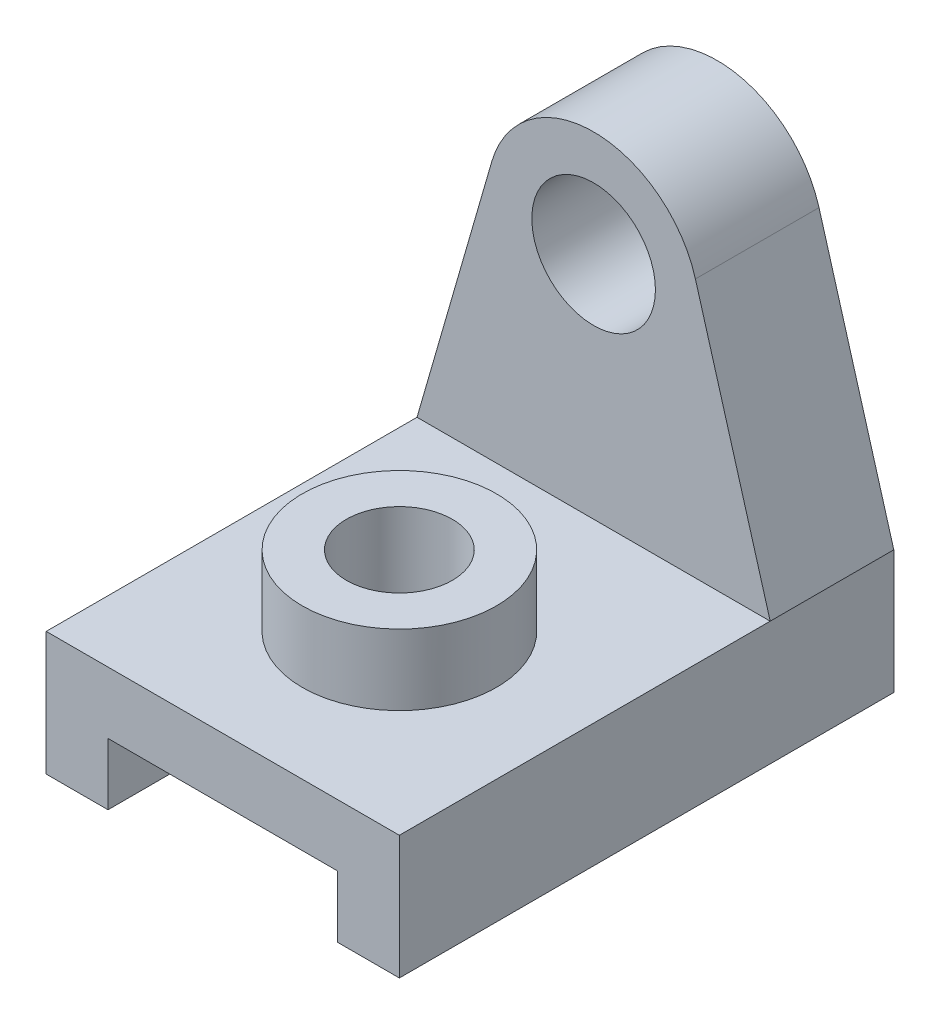
ISO-10303-21;
HEADER;
FILE_DESCRIPTION(('STEP AP214'),'2;1');
FILE_NAME('part.step','',(''),(''),'','','');
FILE_SCHEMA(('AUTOMOTIVE_DESIGN { 1 0 10303 214 1 1 1 1 }'));
ENDSEC;
DATA;
#1=APPLICATION_CONTEXT('core data for automotive mechanical design processes');
#2=APPLICATION_PROTOCOL_DEFINITION('international standard','automotive_design',2000,#1);
#3=PRODUCT_CONTEXT('',#1,'mechanical');
#4=PRODUCT('Part','Part','',(#3));
#5=PRODUCT_RELATED_PRODUCT_CATEGORY('part','',(#4));
#6=PRODUCT_DEFINITION_FORMATION('','',#4);
#7=PRODUCT_DEFINITION_CONTEXT('part definition',#1,'design');
#8=PRODUCT_DEFINITION('design','',#6,#7);
#9=PRODUCT_DEFINITION_SHAPE('','',#8);
#10=(LENGTH_UNIT() NAMED_UNIT(*) SI_UNIT(.MILLI.,.METRE.));
#11=(NAMED_UNIT(*) PLANE_ANGLE_UNIT() SI_UNIT($,.RADIAN.));
#12=(NAMED_UNIT(*) SI_UNIT($,.STERADIAN.) SOLID_ANGLE_UNIT());
#13=UNCERTAINTY_MEASURE_WITH_UNIT(LENGTH_MEASURE(1.E-05),#10,'distance_accuracy_value','');
#14=(GEOMETRIC_REPRESENTATION_CONTEXT(3) GLOBAL_UNCERTAINTY_ASSIGNED_CONTEXT((#13)) GLOBAL_UNIT_ASSIGNED_CONTEXT((#10,
#11,#12)) REPRESENTATION_CONTEXT('',''));
#15=CARTESIAN_POINT('',(0.,0.,0.));
#16=DIRECTION('',(0.,0.,1.));
#17=DIRECTION('',(1.,0.,0.));
#18=AXIS2_PLACEMENT_3D('',#15,#16,#17);
#19=CARTESIAN_POINT('',(0.,14.,0.));
#20=DIRECTION('',(0.,-1.,0.));
#21=DIRECTION('',(0.,0.,-1.));
#22=AXIS2_PLACEMENT_3D('',#19,#20,#21);
#23=PLANE('',#22);
#24=CARTESIAN_POINT('',(0.,14.,36.));
#25=DIRECTION('',(0.,-1.,0.));
#26=DIRECTION('',(0.,0.,-1.));
#27=AXIS2_PLACEMENT_3D('',#24,#25,#26);
#28=CIRCLE('',#27,11.);
#29=CARTESIAN_POINT('',(0.,14.,25.));
#30=VERTEX_POINT('',#29);
#31=EDGE_CURVE('E47',#30,#30,#28,.T.);
#32=ORIENTED_EDGE('',*,*,#31,.T.);
#33=EDGE_LOOP('',(#32));
#34=FACE_BOUND('',#33,.T.);
#35=DIRECTION('',(1.,0.,0.));
#36=VECTOR('',#35,1.);
#37=CARTESIAN_POINT('',(20.,14.,14.));
#38=LINE('',#37,#36);
#39=CARTESIAN_POINT('',(-20.,14.,14.));
#40=VERTEX_POINT('',#39);
#41=CARTESIAN_POINT('',(20.,14.,14.));
#42=VERTEX_POINT('',#41);
#43=EDGE_CURVE('E60',#40,#42,#38,.T.);
#44=ORIENTED_EDGE('',*,*,#43,.F.);
#45=DIRECTION('',(0.,0.,1.));
#46=VECTOR('',#45,1.);
#47=CARTESIAN_POINT('',(-20.,14.,0.));
#48=LINE('',#47,#46);
#49=CARTESIAN_POINT('',(-20.,14.,56.));
#50=VERTEX_POINT('',#49);
#51=EDGE_CURVE('E195',#40,#50,#48,.T.);
#52=ORIENTED_EDGE('',*,*,#51,.T.);
#53=DIRECTION('',(-1.,0.,0.));
#54=VECTOR('',#53,1.);
#55=CARTESIAN_POINT('',(20.,14.,56.));
#56=LINE('',#55,#54);
#57=CARTESIAN_POINT('',(20.,14.,56.));
#58=VERTEX_POINT('',#57);
#59=EDGE_CURVE('E190',#58,#50,#56,.T.);
#60=ORIENTED_EDGE('',*,*,#59,.F.);
#61=DIRECTION('',(0.,0.,1.));
#62=VECTOR('',#61,1.);
#63=CARTESIAN_POINT('',(20.,14.,0.));
#64=LINE('',#63,#62);
#65=EDGE_CURVE('E191',#42,#58,#64,.T.);
#66=ORIENTED_EDGE('',*,*,#65,.F.);
#67=EDGE_LOOP('',(#44,#52,#60,#66));
#68=FACE_BOUND('',#67,.T.);
#69=ADVANCED_FACE('F43',(#34,#68),#23,.F.);
#70=CARTESIAN_POINT('',(-20.,14.,0.));
#71=DIRECTION('',(0.,0.,-1.));
#72=DIRECTION('',(-1.,0.,0.));
#73=AXIS2_PLACEMENT_3D('',#70,#71,#72);
#74=PLANE('',#73);
#75=DIRECTION('',(1.,0.,0.));
#76=VECTOR('',#75,1.);
#77=CARTESIAN_POINT('',(-20.,0.,0.));
#78=LINE('',#77,#76);
#79=CARTESIAN_POINT('',(13.,0.,0.));
#80=VERTEX_POINT('',#79);
#81=CARTESIAN_POINT('',(20.,0.,0.));
#82=VERTEX_POINT('',#81);
#83=EDGE_CURVE('E186',#80,#82,#78,.T.);
#84=ORIENTED_EDGE('',*,*,#83,.F.);
#85=DIRECTION('',(0.,1.,0.));
#86=VECTOR('',#85,1.);
#87=CARTESIAN_POINT('',(13.,0.,0.));
#88=LINE('',#87,#86);
#89=CARTESIAN_POINT('',(13.,7.,0.));
#90=VERTEX_POINT('',#89);
#91=EDGE_CURVE('E157',#80,#90,#88,.T.);
#92=ORIENTED_EDGE('',*,*,#91,.T.);
#93=DIRECTION('',(-1.,0.,0.));
#94=VECTOR('',#93,1.);
#95=CARTESIAN_POINT('',(0.,7.,0.));
#96=LINE('',#95,#94);
#97=CARTESIAN_POINT('',(-13.,7.,0.));
#98=VERTEX_POINT('',#97);
#99=EDGE_CURVE('E162',#90,#98,#96,.T.);
#100=ORIENTED_EDGE('',*,*,#99,.T.);
#101=DIRECTION('',(0.,1.,0.));
#102=VECTOR('',#101,1.);
#103=CARTESIAN_POINT('',(-13.,0.,0.));
#104=LINE('',#103,#102);
#105=CARTESIAN_POINT('',(-13.,0.,0.));
#106=VERTEX_POINT('',#105);
#107=EDGE_CURVE('E170',#106,#98,#104,.T.);
#108=ORIENTED_EDGE('',*,*,#107,.F.);
#109=CARTESIAN_POINT('',(-20.,0.,0.));
#110=VERTEX_POINT('',#109);
#111=EDGE_CURVE('E201',#110,#106,#78,.T.);
#112=ORIENTED_EDGE('',*,*,#111,.F.);
#113=DIRECTION('',(0.,-1.,0.));
#114=VECTOR('',#113,1.);
#115=CARTESIAN_POINT('',(-20.,14.,0.));
#116=LINE('',#115,#114);
#117=CARTESIAN_POINT('',(-20.,14.,0.));
#118=VERTEX_POINT('',#117);
#119=EDGE_CURVE('E218',#118,#110,#116,.T.);
#120=ORIENTED_EDGE('',*,*,#119,.F.);
#121=DIRECTION('',(-0.277483356405681,-0.960730444462877,0.));
#122=VECTOR('',#121,1.);
#123=CARTESIAN_POINT('',(-20.,14.,0.));
#124=LINE('',#123,#122);
#125=CARTESIAN_POINT('',(-11.5288053217591,43.3298118264774,0.));
#126=VERTEX_POINT('',#125);
#127=EDGE_CURVE('E151',#126,#118,#124,.T.);
#128=ORIENTED_EDGE('',*,*,#127,.F.);
#129=CARTESIAN_POINT('',(0.,40.,0.));
#130=DIRECTION('',(0.,0.,1.));
#131=DIRECTION('',(1.,0.,0.));
#132=AXIS2_PLACEMENT_3D('',#129,#130,#131);
#133=CIRCLE('',#132,12.0000416227098);
#134=CARTESIAN_POINT('',(11.5288053217591,43.3298118264774,0.));
#135=VERTEX_POINT('',#134);
#136=EDGE_CURVE('E261',#135,#126,#133,.T.);
#137=ORIENTED_EDGE('',*,*,#136,.F.);
#138=DIRECTION('',(-0.277483356405681,0.960730444462877,0.));
#139=VECTOR('',#138,1.);
#140=CARTESIAN_POINT('',(20.,14.,0.));
#141=LINE('',#140,#139);
#142=CARTESIAN_POINT('',(20.,14.,0.));
#143=VERTEX_POINT('',#142);
#144=EDGE_CURVE('E155',#143,#135,#141,.T.);
#145=ORIENTED_EDGE('',*,*,#144,.F.);
#146=DIRECTION('',(0.,-1.,0.));
#147=VECTOR('',#146,1.);
#148=CARTESIAN_POINT('',(20.,14.,0.));
#149=LINE('',#148,#147);
#150=EDGE_CURVE('E200',#143,#82,#149,.T.);
#151=ORIENTED_EDGE('',*,*,#150,.T.);
#152=EDGE_LOOP('',(#84,#92,#100,#108,#112,#120,#128,#137,#145,#151));
#153=FACE_BOUND('',#152,.T.);
#154=CARTESIAN_POINT('',(0.,40.,0.));
#155=DIRECTION('',(0.,0.,1.));
#156=DIRECTION('',(1.,0.,0.));
#157=AXIS2_PLACEMENT_3D('',#154,#155,#156);
#158=CIRCLE('',#157,7.);
#159=CARTESIAN_POINT('',(7.,40.,0.));
#160=VERTEX_POINT('',#159);
#161=EDGE_CURVE('E269',#160,#160,#158,.T.);
#162=ORIENTED_EDGE('',*,*,#161,.T.);
#163=EDGE_LOOP('',(#162));
#164=FACE_BOUND('',#163,.T.);
#165=ADVANCED_FACE('F45',(#153,#164),#74,.T.);
#166=CARTESIAN_POINT('',(20.,14.,56.));
#167=DIRECTION('',(0.,0.,1.));
#168=DIRECTION('',(1.,0.,0.));
#169=AXIS2_PLACEMENT_3D('',#166,#167,#168);
#170=PLANE('',#169);
#171=DIRECTION('',(1.,0.,0.));
#172=VECTOR('',#171,1.);
#173=CARTESIAN_POINT('',(20.,7.,56.));
#174=LINE('',#173,#172);
#175=CARTESIAN_POINT('',(-13.,7.,56.));
#176=VERTEX_POINT('',#175);
#177=CARTESIAN_POINT('',(13.,7.,56.));
#178=VERTEX_POINT('',#177);
#179=EDGE_CURVE('E11',#176,#178,#174,.T.);
#180=ORIENTED_EDGE('',*,*,#179,.T.);
#181=DIRECTION('',(0.,-1.,0.));
#182=VECTOR('',#181,1.);
#183=CARTESIAN_POINT('',(13.,14.,56.));
#184=LINE('',#183,#182);
#185=CARTESIAN_POINT('',(13.,0.,56.));
#186=VERTEX_POINT('',#185);
#187=EDGE_CURVE('E182',#178,#186,#184,.T.);
#188=ORIENTED_EDGE('',*,*,#187,.T.);
#189=DIRECTION('',(-1.,0.,0.));
#190=VECTOR('',#189,1.);
#191=CARTESIAN_POINT('',(20.,0.,56.));
#192=LINE('',#191,#190);
#193=CARTESIAN_POINT('',(20.,0.,56.));
#194=VERTEX_POINT('',#193);
#195=EDGE_CURVE('E210',#194,#186,#192,.T.);
#196=ORIENTED_EDGE('',*,*,#195,.F.);
#197=DIRECTION('',(0.,-1.,0.));
#198=VECTOR('',#197,1.);
#199=CARTESIAN_POINT('',(20.,14.,56.));
#200=LINE('',#199,#198);
#201=EDGE_CURVE('E226',#58,#194,#200,.T.);
#202=ORIENTED_EDGE('',*,*,#201,.F.);
#203=ORIENTED_EDGE('',*,*,#59,.T.);
#204=DIRECTION('',(0.,-1.,0.));
#205=VECTOR('',#204,1.);
#206=CARTESIAN_POINT('',(-20.,14.,56.));
#207=LINE('',#206,#205);
#208=CARTESIAN_POINT('',(-20.,0.,56.));
#209=VERTEX_POINT('',#208);
#210=EDGE_CURVE('E222',#50,#209,#207,.T.);
#211=ORIENTED_EDGE('',*,*,#210,.T.);
#212=CARTESIAN_POINT('',(-13.,0.,56.));
#213=VERTEX_POINT('',#212);
#214=EDGE_CURVE('E209',#213,#209,#192,.T.);
#215=ORIENTED_EDGE('',*,*,#214,.F.);
#216=DIRECTION('',(0.,-1.,0.));
#217=VECTOR('',#216,1.);
#218=CARTESIAN_POINT('',(-13.,14.,56.));
#219=LINE('',#218,#217);
#220=EDGE_CURVE('E68',#176,#213,#219,.T.);
#221=ORIENTED_EDGE('',*,*,#220,.F.);
#222=EDGE_LOOP('',(#180,#188,#196,#202,#203,#211,#215,#221));
#223=FACE_BOUND('',#222,.T.);
#224=ADVANCED_FACE('F257',(#223),#170,.T.);
#225=CARTESIAN_POINT('',(0.,0.,0.));
#226=DIRECTION('',(0.,-1.,0.));
#227=DIRECTION('',(0.,0.,-1.));
#228=AXIS2_PLACEMENT_3D('',#225,#226,#227);
#229=PLANE('',#228);
#230=ORIENTED_EDGE('',*,*,#195,.T.);
#231=DIRECTION('',(0.,0.,-1.));
#232=VECTOR('',#231,1.);
#233=CARTESIAN_POINT('',(13.,0.,0.));
#234=LINE('',#233,#232);
#235=EDGE_CURVE('E53',#186,#80,#234,.T.);
#236=ORIENTED_EDGE('',*,*,#235,.T.);
#237=ORIENTED_EDGE('',*,*,#83,.T.);
#238=DIRECTION('',(0.,0.,1.));
#239=VECTOR('',#238,1.);
#240=CARTESIAN_POINT('',(20.,0.,0.));
#241=LINE('',#240,#239);
#242=EDGE_CURVE('E205',#82,#194,#241,.T.);
#243=ORIENTED_EDGE('',*,*,#242,.T.);
#244=EDGE_LOOP('',(#230,#236,#237,#243));
#245=FACE_BOUND('',#244,.T.);
#246=ADVANCED_FACE('F238',(#245),#229,.T.);
#247=CARTESIAN_POINT('',(-20.,14.,0.));
#248=DIRECTION('',(1.,0.,0.));
#249=DIRECTION('',(0.,0.,-1.));
#250=AXIS2_PLACEMENT_3D('',#247,#248,#249);
#251=PLANE('',#250);
#252=DIRECTION('',(0.,0.,1.));
#253=VECTOR('',#252,1.);
#254=CARTESIAN_POINT('',(-20.,0.,0.));
#255=LINE('',#254,#253);
#256=EDGE_CURVE('E214',#110,#209,#255,.T.);
#257=ORIENTED_EDGE('',*,*,#256,.T.);
#258=ORIENTED_EDGE('',*,*,#210,.F.);
#259=ORIENTED_EDGE('',*,*,#51,.F.);
#260=EDGE_CURVE('E196',#118,#40,#48,.T.);
#261=ORIENTED_EDGE('',*,*,#260,.F.);
#262=ORIENTED_EDGE('',*,*,#119,.T.);
#263=EDGE_LOOP('',(#257,#258,#259,#261,#262));
#264=FACE_BOUND('',#263,.T.);
#265=ADVANCED_FACE('F252',(#264),#251,.F.);
#266=CARTESIAN_POINT('',(20.,14.,0.));
#267=DIRECTION('',(1.,0.,0.));
#268=DIRECTION('',(0.,0.,-1.));
#269=AXIS2_PLACEMENT_3D('',#266,#267,#268);
#270=PLANE('',#269);
#271=ORIENTED_EDGE('',*,*,#242,.F.);
#272=ORIENTED_EDGE('',*,*,#150,.F.);
#273=EDGE_CURVE('E187',#143,#42,#64,.T.);
#274=ORIENTED_EDGE('',*,*,#273,.T.);
#275=ORIENTED_EDGE('',*,*,#65,.T.);
#276=ORIENTED_EDGE('',*,*,#201,.T.);
#277=EDGE_LOOP('',(#271,#272,#274,#275,#276));
#278=FACE_BOUND('',#277,.T.);
#279=ADVANCED_FACE('F259',(#278),#270,.T.);
#280=DIRECTION('',(0.,0.,-1.));
#281=VECTOR('',#280,1.);
#282=CARTESIAN_POINT('',(-13.,0.,0.));
#283=LINE('',#282,#281);
#284=EDGE_CURVE('E221',#213,#106,#283,.T.);
#285=ORIENTED_EDGE('',*,*,#284,.F.);
#286=ORIENTED_EDGE('',*,*,#214,.T.);
#287=ORIENTED_EDGE('',*,*,#256,.F.);
#288=ORIENTED_EDGE('',*,*,#111,.T.);
#289=EDGE_LOOP('',(#285,#286,#287,#288));
#290=FACE_BOUND('',#289,.T.);
#291=ADVANCED_FACE('F280',(#290),#229,.T.);
#292=CARTESIAN_POINT('',(13.,0.,68.));
#293=DIRECTION('',(-1.,0.,0.));
#294=DIRECTION('',(0.,0.,1.));
#295=AXIS2_PLACEMENT_3D('',#292,#293,#294);
#296=PLANE('',#295);
#297=DIRECTION('',(0.,0.,-1.));
#298=VECTOR('',#297,1.);
#299=CARTESIAN_POINT('',(13.,7.,68.));
#300=LINE('',#299,#298);
#301=EDGE_CURVE('E177',#178,#90,#300,.T.);
#302=ORIENTED_EDGE('',*,*,#301,.T.);
#303=ORIENTED_EDGE('',*,*,#91,.F.);
#304=ORIENTED_EDGE('',*,*,#235,.F.);
#305=ORIENTED_EDGE('',*,*,#187,.F.);
#306=EDGE_LOOP('',(#302,#303,#304,#305));
#307=FACE_BOUND('',#306,.T.);
#308=ADVANCED_FACE('F293',(#307),#296,.T.);
#309=CARTESIAN_POINT('',(0.,7.,68.));
#310=DIRECTION('',(0.,-1.,0.));
#311=DIRECTION('',(0.,0.,-1.));
#312=AXIS2_PLACEMENT_3D('',#309,#310,#311);
#313=PLANE('',#312);
#314=CARTESIAN_POINT('',(0.,7.,36.));
#315=DIRECTION('',(0.,-1.,0.));
#316=DIRECTION('',(0.,0.,-1.));
#317=AXIS2_PLACEMENT_3D('',#314,#315,#316);
#318=CIRCLE('',#317,6.);
#319=CARTESIAN_POINT('',(0.,7.,30.));
#320=VERTEX_POINT('',#319);
#321=EDGE_CURVE('E458',#320,#320,#318,.T.);
#322=ORIENTED_EDGE('',*,*,#321,.F.);
#323=EDGE_LOOP('',(#322));
#324=FACE_BOUND('',#323,.T.);
#325=DIRECTION('',(0.,0.,-1.));
#326=VECTOR('',#325,1.);
#327=CARTESIAN_POINT('',(-13.,7.,68.));
#328=LINE('',#327,#326);
#329=EDGE_CURVE('E174',#176,#98,#328,.T.);
#330=ORIENTED_EDGE('',*,*,#329,.T.);
#331=ORIENTED_EDGE('',*,*,#99,.F.);
#332=ORIENTED_EDGE('',*,*,#301,.F.);
#333=ORIENTED_EDGE('',*,*,#179,.F.);
#334=EDGE_LOOP('',(#330,#331,#332,#333));
#335=FACE_BOUND('',#334,.T.);
#336=ADVANCED_FACE('F283',(#324,#335),#313,.T.);
#337=CARTESIAN_POINT('',(-13.,0.,68.));
#338=DIRECTION('',(-1.,0.,0.));
#339=DIRECTION('',(0.,0.,1.));
#340=AXIS2_PLACEMENT_3D('',#337,#338,#339);
#341=PLANE('',#340);
#342=ORIENTED_EDGE('',*,*,#220,.T.);
#343=ORIENTED_EDGE('',*,*,#284,.T.);
#344=ORIENTED_EDGE('',*,*,#107,.T.);
#345=ORIENTED_EDGE('',*,*,#329,.F.);
#346=EDGE_LOOP('',(#342,#343,#344,#345));
#347=FACE_BOUND('',#346,.T.);
#348=ADVANCED_FACE('F285',(#347),#341,.F.);
#349=CARTESIAN_POINT('',(0.,40.,14.));
#350=DIRECTION('',(0.,0.,1.));
#351=DIRECTION('',(1.,0.,0.));
#352=AXIS2_PLACEMENT_3D('',#349,#350,#351);
#353=PLANE('',#352);
#354=DIRECTION('',(-0.277483356405681,0.960730444462877,0.));
#355=VECTOR('',#354,1.);
#356=CARTESIAN_POINT('',(20.,14.,14.));
#357=LINE('',#356,#355);
#358=CARTESIAN_POINT('',(11.5288053217591,43.3298118264774,14.));
#359=VERTEX_POINT('',#358);
#360=EDGE_CURVE('E143',#42,#359,#357,.T.);
#361=ORIENTED_EDGE('',*,*,#360,.T.);
#362=CARTESIAN_POINT('',(0.,40.,14.));
#363=DIRECTION('',(0.,0.,1.));
#364=DIRECTION('',(1.,0.,0.));
#365=AXIS2_PLACEMENT_3D('',#362,#363,#364);
#366=CIRCLE('',#365,12.0000416227098);
#367=CARTESIAN_POINT('',(-11.5288053217591,43.3298118264774,14.));
#368=VERTEX_POINT('',#367);
#369=EDGE_CURVE('E130',#359,#368,#366,.T.);
#370=ORIENTED_EDGE('',*,*,#369,.T.);
#371=DIRECTION('',(-0.277483356405681,-0.960730444462877,0.));
#372=VECTOR('',#371,1.);
#373=CARTESIAN_POINT('',(-20.,14.,14.));
#374=LINE('',#373,#372);
#375=EDGE_CURVE('E142',#368,#40,#374,.T.);
#376=ORIENTED_EDGE('',*,*,#375,.T.);
#377=ORIENTED_EDGE('',*,*,#43,.T.);
#378=EDGE_LOOP('',(#361,#370,#376,#377));
#379=FACE_BOUND('',#378,.T.);
#380=CARTESIAN_POINT('',(0.,40.,14.));
#381=DIRECTION('',(0.,0.,1.));
#382=DIRECTION('',(1.,0.,0.));
#383=AXIS2_PLACEMENT_3D('',#380,#381,#382);
#384=CIRCLE('',#383,7.);
#385=CARTESIAN_POINT('',(7.,40.,14.));
#386=VERTEX_POINT('',#385);
#387=EDGE_CURVE('E263',#386,#386,#384,.T.);
#388=ORIENTED_EDGE('',*,*,#387,.F.);
#389=EDGE_LOOP('',(#388));
#390=FACE_BOUND('',#389,.T.);
#391=ADVANCED_FACE('F146',(#379,#390),#353,.T.);
#392=CARTESIAN_POINT('',(20.,14.,14.));
#393=DIRECTION('',(-0.960730444462877,-0.277483356405681,0.));
#394=DIRECTION('',(0.277483356405681,-0.960730444462877,0.));
#395=AXIS2_PLACEMENT_3D('',#392,#393,#394);
#396=PLANE('',#395);
#397=ORIENTED_EDGE('',*,*,#144,.T.);
#398=DIRECTION('',(0.,0.,-1.));
#399=VECTOR('',#398,1.);
#400=CARTESIAN_POINT('',(11.5288053217591,43.3298118264774,14.));
#401=LINE('',#400,#399);
#402=EDGE_CURVE('E134',#359,#135,#401,.T.);
#403=ORIENTED_EDGE('',*,*,#402,.F.);
#404=ORIENTED_EDGE('',*,*,#360,.F.);
#405=ORIENTED_EDGE('',*,*,#273,.F.);
#406=EDGE_LOOP('',(#397,#403,#404,#405));
#407=FACE_BOUND('',#406,.T.);
#408=ADVANCED_FACE('F153',(#407),#396,.F.);
#409=CARTESIAN_POINT('',(0.,40.,14.));
#410=DIRECTION('',(0.,0.,-1.));
#411=DIRECTION('',(-1.,0.,0.));
#412=AXIS2_PLACEMENT_3D('',#409,#410,#411);
#413=CYLINDRICAL_SURFACE('',#412,12.0000416227098);
#414=ORIENTED_EDGE('',*,*,#136,.T.);
#415=DIRECTION('',(0.,0.,-1.));
#416=VECTOR('',#415,1.);
#417=CARTESIAN_POINT('',(-11.5288053217591,43.3298118264774,14.));
#418=LINE('',#417,#416);
#419=EDGE_CURVE('E137',#368,#126,#418,.T.);
#420=ORIENTED_EDGE('',*,*,#419,.F.);
#421=ORIENTED_EDGE('',*,*,#369,.F.);
#422=ORIENTED_EDGE('',*,*,#402,.T.);
#423=EDGE_LOOP('',(#414,#420,#421,#422));
#424=FACE_BOUND('',#423,.T.);
#425=ADVANCED_FACE('F132',(#424),#413,.T.);
#426=CARTESIAN_POINT('',(-20.,14.,14.));
#427=DIRECTION('',(0.960730444462877,-0.277483356405681,0.));
#428=DIRECTION('',(0.277483356405681,0.960730444462877,0.));
#429=AXIS2_PLACEMENT_3D('',#426,#427,#428);
#430=PLANE('',#429);
#431=ORIENTED_EDGE('',*,*,#127,.T.);
#432=ORIENTED_EDGE('',*,*,#260,.T.);
#433=ORIENTED_EDGE('',*,*,#375,.F.);
#434=ORIENTED_EDGE('',*,*,#419,.T.);
#435=EDGE_LOOP('',(#431,#432,#433,#434));
#436=FACE_BOUND('',#435,.T.);
#437=ADVANCED_FACE('F276',(#436),#430,.F.);
#438=CARTESIAN_POINT('',(0.,40.,14.));
#439=DIRECTION('',(0.,0.,-1.));
#440=DIRECTION('',(-1.,0.,0.));
#441=AXIS2_PLACEMENT_3D('',#438,#439,#440);
#442=CYLINDRICAL_SURFACE('',#441,7.);
#443=ORIENTED_EDGE('',*,*,#387,.T.);
#444=EDGE_LOOP('',(#443));
#445=FACE_BOUND('',#444,.T.);
#446=ORIENTED_EDGE('',*,*,#161,.F.);
#447=EDGE_LOOP('',(#446));
#448=FACE_BOUND('',#447,.T.);
#449=ADVANCED_FACE('F366',(#445,#448),#442,.F.);
#450=CARTESIAN_POINT('',(0.,13.,36.));
#451=DIRECTION('',(0.,1.,0.));
#452=DIRECTION('',(0.,0.,1.));
#453=AXIS2_PLACEMENT_3D('',#450,#451,#452);
#454=CYLINDRICAL_SURFACE('',#453,11.);
#455=CARTESIAN_POINT('',(0.,22.,36.));
#456=DIRECTION('',(0.,1.,0.));
#457=DIRECTION('',(0.,0.,1.));
#458=AXIS2_PLACEMENT_3D('',#455,#456,#457);
#459=CIRCLE('',#458,11.);
#460=CARTESIAN_POINT('',(0.,22.,47.));
#461=VERTEX_POINT('',#460);
#462=EDGE_CURVE('E451',#461,#461,#459,.T.);
#463=ORIENTED_EDGE('',*,*,#462,.F.);
#464=EDGE_LOOP('',(#463));
#465=FACE_BOUND('',#464,.T.);
#466=ORIENTED_EDGE('',*,*,#31,.F.);
#467=EDGE_LOOP('',(#466));
#468=FACE_BOUND('',#467,.T.);
#469=ADVANCED_FACE('F339',(#465,#468),#454,.T.);
#470=CARTESIAN_POINT('',(0.,22.,0.));
#471=DIRECTION('',(0.,1.,0.));
#472=DIRECTION('',(0.,0.,1.));
#473=AXIS2_PLACEMENT_3D('',#470,#471,#472);
#474=PLANE('',#473);
#475=CARTESIAN_POINT('',(0.,22.,36.));
#476=DIRECTION('',(0.,1.,0.));
#477=DIRECTION('',(0.,0.,1.));
#478=AXIS2_PLACEMENT_3D('',#475,#476,#477);
#479=CIRCLE('',#478,6.);
#480=CARTESIAN_POINT('',(0.,22.,42.));
#481=VERTEX_POINT('',#480);
#482=EDGE_CURVE('E461',#481,#481,#479,.T.);
#483=ORIENTED_EDGE('',*,*,#482,.F.);
#484=EDGE_LOOP('',(#483));
#485=FACE_BOUND('',#484,.T.);
#486=ORIENTED_EDGE('',*,*,#462,.T.);
#487=EDGE_LOOP('',(#486));
#488=FACE_BOUND('',#487,.T.);
#489=ADVANCED_FACE('F343',(#485,#488),#474,.T.);
#490=CARTESIAN_POINT('',(0.,-22.,36.));
#491=DIRECTION('',(0.,1.,0.));
#492=DIRECTION('',(0.,0.,1.));
#493=AXIS2_PLACEMENT_3D('',#490,#491,#492);
#494=CYLINDRICAL_SURFACE('',#493,6.);
#495=ORIENTED_EDGE('',*,*,#321,.T.);
#496=EDGE_LOOP('',(#495));
#497=FACE_BOUND('',#496,.T.);
#498=ORIENTED_EDGE('',*,*,#482,.T.);
#499=EDGE_LOOP('',(#498));
#500=FACE_BOUND('',#499,.T.);
#501=ADVANCED_FACE('F348',(#497,#500),#494,.F.);
#502=CLOSED_SHELL('',(#69,#165,#224,#246,#265,#279,#291,#308,#336,#348,#391,#408,#425,#437,#449,
#469,#489,#501));
#503=MANIFOLD_SOLID_BREP('B2',#502);
#504=ADVANCED_BREP_SHAPE_REPRESENTATION('',(#18,#503),#14);
#505=SHAPE_DEFINITION_REPRESENTATION(#9,#504);
ENDSEC;
END-ISO-10303-21;
